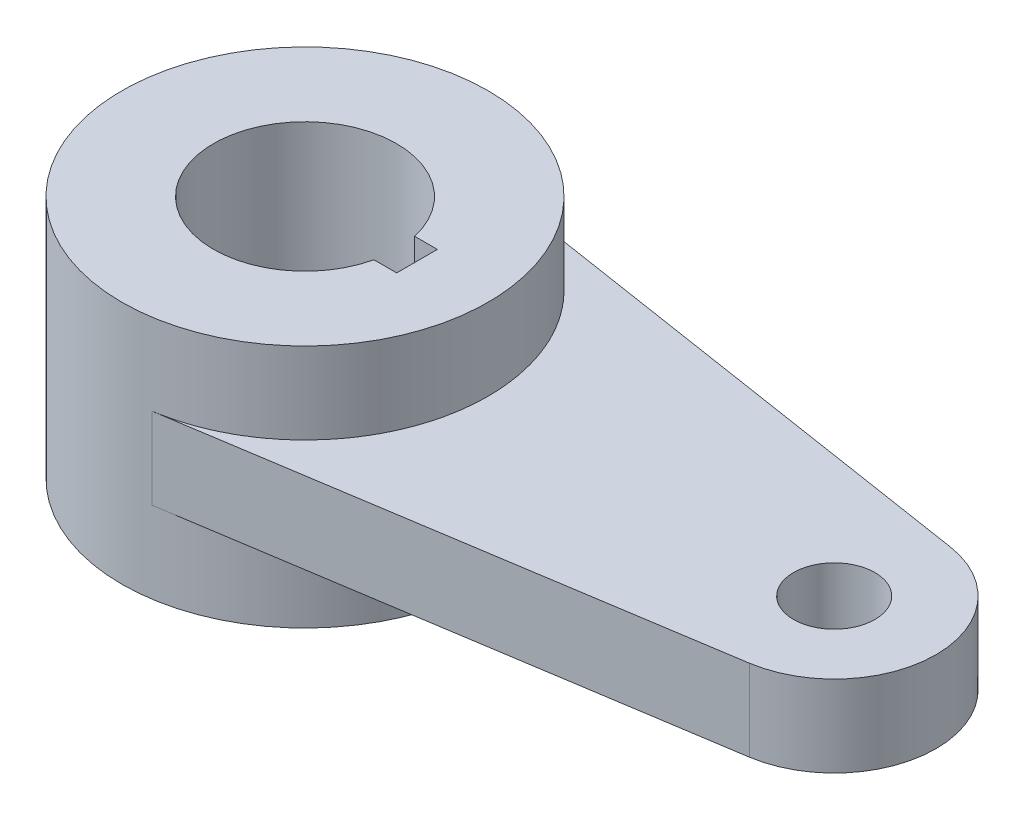
ISO-10303-21;
HEADER;
FILE_DESCRIPTION(('STEP AP214'),'2;1');
FILE_NAME('part.step','',(''),(''),'','','');
FILE_SCHEMA(('AUTOMOTIVE_DESIGN { 1 0 10303 214 1 1 1 1 }'));
ENDSEC;
DATA;
#1=APPLICATION_CONTEXT('core data for automotive mechanical design processes');
#2=APPLICATION_PROTOCOL_DEFINITION('international standard','automotive_design',2000,#1);
#3=PRODUCT_CONTEXT('',#1,'mechanical');
#4=PRODUCT('Part','Part','',(#3));
#5=PRODUCT_RELATED_PRODUCT_CATEGORY('part','',(#4));
#6=PRODUCT_DEFINITION_FORMATION('','',#4);
#7=PRODUCT_DEFINITION_CONTEXT('part definition',#1,'design');
#8=PRODUCT_DEFINITION('design','',#6,#7);
#9=PRODUCT_DEFINITION_SHAPE('','',#8);
#10=(LENGTH_UNIT() NAMED_UNIT(*) SI_UNIT(.MILLI.,.METRE.));
#11=(NAMED_UNIT(*) PLANE_ANGLE_UNIT() SI_UNIT($,.RADIAN.));
#12=(NAMED_UNIT(*) SI_UNIT($,.STERADIAN.) SOLID_ANGLE_UNIT());
#13=UNCERTAINTY_MEASURE_WITH_UNIT(LENGTH_MEASURE(1.E-05),#10,'distance_accuracy_value','');
#14=(GEOMETRIC_REPRESENTATION_CONTEXT(3) GLOBAL_UNCERTAINTY_ASSIGNED_CONTEXT((#13)) GLOBAL_UNIT_ASSIGNED_CONTEXT((#10,
#11,#12)) REPRESENTATION_CONTEXT('',''));
#15=CARTESIAN_POINT('',(0.,0.,0.));
#16=DIRECTION('',(0.,0.,1.));
#17=DIRECTION('',(1.,0.,0.));
#18=AXIS2_PLACEMENT_3D('',#15,#16,#17);
#19=CARTESIAN_POINT('',(0.,6.35,0.));
#20=DIRECTION('',(0.,1.,0.));
#21=DIRECTION('',(0.,0.,1.));
#22=AXIS2_PLACEMENT_3D('',#19,#20,#21);
#23=PLANE('',#22);
#24=CARTESIAN_POINT('',(0.,6.35,0.));
#25=DIRECTION('',(0.,-1.,0.));
#26=DIRECTION('',(0.,0.,1.));
#27=AXIS2_PLACEMENT_3D('',#24,#25,#26);
#28=CIRCLE('',#27,28.575);
#29=CARTESIAN_POINT('',(4.39615384615385,6.35,-28.2348093027197));
#30=VERTEX_POINT('',#29);
#31=CARTESIAN_POINT('',(4.39615384615385,6.35,28.2348093027197));
#32=VERTEX_POINT('',#31);
#33=EDGE_CURVE('E98',#30,#32,#28,.T.);
#34=ORIENTED_EDGE('',*,*,#33,.T.);
#35=DIRECTION('',(0.988094813743471,0.,-0.153846153846154));
#36=VECTOR('',#35,1.);
#37=CARTESIAN_POINT('',(4.39615384615385,6.35,28.2348093027197));
#38=LINE('',#37,#36);
#39=CARTESIAN_POINT('',(84.9923076923077,6.35,15.6860051681776));
#40=VERTEX_POINT('',#39);
#41=EDGE_CURVE('E93',#32,#40,#38,.T.);
#42=ORIENTED_EDGE('',*,*,#41,.T.);
#43=CARTESIAN_POINT('',(82.55,6.35,0.));
#44=DIRECTION('',(0.,1.,0.));
#45=DIRECTION('',(0.,0.,1.));
#46=AXIS2_PLACEMENT_3D('',#43,#44,#45);
#47=CIRCLE('',#46,15.875);
#48=CARTESIAN_POINT('',(84.9923076923077,6.35,-15.6860051681776));
#49=VERTEX_POINT('',#48);
#50=EDGE_CURVE('E96',#40,#49,#47,.T.);
#51=ORIENTED_EDGE('',*,*,#50,.T.);
#52=DIRECTION('',(-0.988094813743471,0.,-0.153846153846154));
#53=VECTOR('',#52,1.);
#54=CARTESIAN_POINT('',(4.39615384615385,6.35,-28.2348093027197));
#55=LINE('',#54,#53);
#56=EDGE_CURVE('E63',#49,#30,#55,.T.);
#57=ORIENTED_EDGE('',*,*,#56,.T.);
#58=EDGE_LOOP('',(#34,#42,#51,#57));
#59=FACE_BOUND('',#58,.T.);
#60=CARTESIAN_POINT('',(82.55,6.35,0.));
#61=DIRECTION('',(0.,1.,0.));
#62=DIRECTION('',(0.,0.,1.));
#63=AXIS2_PLACEMENT_3D('',#60,#61,#62);
#64=CIRCLE('',#63,6.35);
#65=CARTESIAN_POINT('',(82.55,6.35,6.35));
#66=VERTEX_POINT('',#65);
#67=EDGE_CURVE('E113',#66,#66,#64,.T.);
#68=ORIENTED_EDGE('',*,*,#67,.F.);
#69=EDGE_LOOP('',(#68));
#70=FACE_BOUND('',#69,.T.);
#71=ADVANCED_FACE('F46',(#59,#70),#23,.T.);
#72=CARTESIAN_POINT('',(0.,-6.35,0.));
#73=DIRECTION('',(0.,1.,0.));
#74=DIRECTION('',(0.,0.,1.));
#75=AXIS2_PLACEMENT_3D('',#72,#73,#74);
#76=PLANE('',#75);
#77=CARTESIAN_POINT('',(0.,-6.35,0.));
#78=DIRECTION('',(0.,-1.,0.));
#79=DIRECTION('',(0.,0.,1.));
#80=AXIS2_PLACEMENT_3D('',#77,#78,#79);
#81=CIRCLE('',#80,28.575);
#82=CARTESIAN_POINT('',(4.39615384615385,-6.35,-28.2348093027197));
#83=VERTEX_POINT('',#82);
#84=CARTESIAN_POINT('',(4.39615384615385,-6.35,28.2348093027197));
#85=VERTEX_POINT('',#84);
#86=EDGE_CURVE('E110',#83,#85,#81,.T.);
#87=ORIENTED_EDGE('',*,*,#86,.F.);
#88=DIRECTION('',(-0.988094813743471,0.,-0.153846153846154));
#89=VECTOR('',#88,1.);
#90=CARTESIAN_POINT('',(4.39615384615385,-6.35,-28.2348093027197));
#91=LINE('',#90,#89);
#92=CARTESIAN_POINT('',(84.9923076923077,-6.35,-15.6860051681776));
#93=VERTEX_POINT('',#92);
#94=EDGE_CURVE('E86',#93,#83,#91,.T.);
#95=ORIENTED_EDGE('',*,*,#94,.F.);
#96=CARTESIAN_POINT('',(82.55,-6.35,0.));
#97=DIRECTION('',(0.,1.,0.));
#98=DIRECTION('',(0.,0.,1.));
#99=AXIS2_PLACEMENT_3D('',#96,#97,#98);
#100=CIRCLE('',#99,15.875);
#101=CARTESIAN_POINT('',(84.9923076923077,-6.35,15.6860051681776));
#102=VERTEX_POINT('',#101);
#103=EDGE_CURVE('E80',#102,#93,#100,.T.);
#104=ORIENTED_EDGE('',*,*,#103,.F.);
#105=DIRECTION('',(0.988094813743471,0.,-0.153846153846154));
#106=VECTOR('',#105,1.);
#107=CARTESIAN_POINT('',(4.39615384615385,-6.35,28.2348093027197));
#108=LINE('',#107,#106);
#109=EDGE_CURVE('E102',#85,#102,#108,.T.);
#110=ORIENTED_EDGE('',*,*,#109,.F.);
#111=EDGE_LOOP('',(#87,#95,#104,#110));
#112=FACE_BOUND('',#111,.T.);
#113=CARTESIAN_POINT('',(82.55,-6.35,0.));
#114=DIRECTION('',(0.,1.,0.));
#115=DIRECTION('',(0.,0.,1.));
#116=AXIS2_PLACEMENT_3D('',#113,#114,#115);
#117=CIRCLE('',#116,6.35);
#118=CARTESIAN_POINT('',(82.55,-6.35,6.35));
#119=VERTEX_POINT('',#118);
#120=EDGE_CURVE('E125',#119,#119,#117,.T.);
#121=ORIENTED_EDGE('',*,*,#120,.T.);
#122=EDGE_LOOP('',(#121));
#123=FACE_BOUND('',#122,.T.);
#124=ADVANCED_FACE('F121',(#112,#123),#76,.F.);
#125=CARTESIAN_POINT('',(0.,6.35,0.));
#126=DIRECTION('',(0.,-1.,0.));
#127=DIRECTION('',(0.,0.,-1.));
#128=AXIS2_PLACEMENT_3D('',#125,#126,#127);
#129=CYLINDRICAL_SURFACE('',#128,28.575);
#130=ORIENTED_EDGE('',*,*,#86,.T.);
#131=DIRECTION('',(0.,-1.,0.));
#132=VECTOR('',#131,1.);
#133=CARTESIAN_POINT('',(4.39615384615385,6.35,28.2348093027197));
#134=LINE('',#133,#132);
#135=EDGE_CURVE('E12',#32,#85,#134,.T.);
#136=ORIENTED_EDGE('',*,*,#135,.F.);
#137=ORIENTED_EDGE('',*,*,#33,.F.);
#138=DIRECTION('',(0.,-1.,0.));
#139=VECTOR('',#138,1.);
#140=CARTESIAN_POINT('',(4.39615384615385,6.35,-28.2348093027197));
#141=LINE('',#140,#139);
#142=EDGE_CURVE('E106',#30,#83,#141,.T.);
#143=ORIENTED_EDGE('',*,*,#142,.T.);
#144=EDGE_LOOP('',(#130,#136,#137,#143));
#145=FACE_BOUND('',#144,.T.);
#146=ADVANCED_FACE('F48',(#145),#129,.F.);
#147=CARTESIAN_POINT('',(4.39615384615385,6.35,28.2348093027197));
#148=DIRECTION('',(-0.153846153846154,0.,-0.988094813743471));
#149=DIRECTION('',(-0.988094813743472,0.,0.153846153846154));
#150=AXIS2_PLACEMENT_3D('',#147,#148,#149);
#151=PLANE('',#150);
#152=ORIENTED_EDGE('',*,*,#109,.T.);
#153=DIRECTION('',(0.,-1.,0.));
#154=VECTOR('',#153,1.);
#155=CARTESIAN_POINT('',(84.9923076923077,6.35,15.6860051681776));
#156=LINE('',#155,#154);
#157=EDGE_CURVE('E55',#40,#102,#156,.T.);
#158=ORIENTED_EDGE('',*,*,#157,.F.);
#159=ORIENTED_EDGE('',*,*,#41,.F.);
#160=ORIENTED_EDGE('',*,*,#135,.T.);
#161=EDGE_LOOP('',(#152,#158,#159,#160));
#162=FACE_BOUND('',#161,.T.);
#163=ADVANCED_FACE('F101',(#162),#151,.F.);
#164=CARTESIAN_POINT('',(82.55,6.35,0.));
#165=DIRECTION('',(0.,-1.,0.));
#166=DIRECTION('',(0.,0.,-1.));
#167=AXIS2_PLACEMENT_3D('',#164,#165,#166);
#168=CYLINDRICAL_SURFACE('',#167,15.875);
#169=ORIENTED_EDGE('',*,*,#103,.T.);
#170=DIRECTION('',(0.,-1.,0.));
#171=VECTOR('',#170,1.);
#172=CARTESIAN_POINT('',(84.9923076923077,6.35,-15.6860051681776));
#173=LINE('',#172,#171);
#174=EDGE_CURVE('E103',#49,#93,#173,.T.);
#175=ORIENTED_EDGE('',*,*,#174,.F.);
#176=ORIENTED_EDGE('',*,*,#50,.F.);
#177=ORIENTED_EDGE('',*,*,#157,.T.);
#178=EDGE_LOOP('',(#169,#175,#176,#177));
#179=FACE_BOUND('',#178,.T.);
#180=ADVANCED_FACE('F104',(#179),#168,.T.);
#181=CARTESIAN_POINT('',(4.39615384615385,6.35,-28.2348093027197));
#182=DIRECTION('',(-0.153846153846154,0.,0.988094813743471));
#183=DIRECTION('',(0.988094813743472,0.,0.153846153846154));
#184=AXIS2_PLACEMENT_3D('',#181,#182,#183);
#185=PLANE('',#184);
#186=ORIENTED_EDGE('',*,*,#94,.T.);
#187=ORIENTED_EDGE('',*,*,#142,.F.);
#188=ORIENTED_EDGE('',*,*,#56,.F.);
#189=ORIENTED_EDGE('',*,*,#174,.T.);
#190=EDGE_LOOP('',(#186,#187,#188,#189));
#191=FACE_BOUND('',#190,.T.);
#192=ADVANCED_FACE('F118',(#191),#185,.F.);
#193=CARTESIAN_POINT('',(82.55,6.35,0.));
#194=DIRECTION('',(0.,-1.,0.));
#195=DIRECTION('',(0.,0.,-1.));
#196=AXIS2_PLACEMENT_3D('',#193,#194,#195);
#197=CYLINDRICAL_SURFACE('',#196,6.35);
#198=ORIENTED_EDGE('',*,*,#67,.T.);
#199=EDGE_LOOP('',(#198));
#200=FACE_BOUND('',#199,.T.);
#201=ORIENTED_EDGE('',*,*,#120,.F.);
#202=EDGE_LOOP('',(#201));
#203=FACE_BOUND('',#202,.T.);
#204=ADVANCED_FACE('F131',(#200,#203),#197,.F.);
#205=CLOSED_SHELL('',(#71,#124,#146,#163,#180,#192,#204));
#206=MANIFOLD_SOLID_BREP('B2',#205);
#207=CARTESIAN_POINT('',(0.,19.05,0.));
#208=DIRECTION('',(0.,1.,0.));
#209=DIRECTION('',(0.,0.,1.));
#210=AXIS2_PLACEMENT_3D('',#207,#208,#209);
#211=PLANE('',#210);
#212=CARTESIAN_POINT('',(0.,19.05,0.));
#213=DIRECTION('',(0.,1.,0.));
#214=DIRECTION('',(0.,0.,1.));
#215=AXIS2_PLACEMENT_3D('',#212,#213,#214);
#216=CIRCLE('',#215,28.575);
#217=CARTESIAN_POINT('',(0.,19.05,-28.575));
#218=VERTEX_POINT('',#217);
#219=EDGE_CURVE('E262',#218,#218,#216,.T.);
#220=ORIENTED_EDGE('',*,*,#219,.T.);
#221=EDGE_LOOP('',(#220));
#222=FACE_BOUND('',#221,.T.);
#223=CARTESIAN_POINT('',(0.,19.05,0.));
#224=DIRECTION('',(0.,1.,0.));
#225=DIRECTION('',(0.,0.,1.));
#226=AXIS2_PLACEMENT_3D('',#223,#224,#225);
#227=CIRCLE('',#226,14.2875);
#228=CARTESIAN_POINT('',(13.930255964985,19.05,-3.175));
#229=VERTEX_POINT('',#228);
#230=CARTESIAN_POINT('',(13.930255964985,19.05,3.175));
#231=VERTEX_POINT('',#230);
#232=EDGE_CURVE('E249',#229,#231,#227,.T.);
#233=ORIENTED_EDGE('',*,*,#232,.F.);
#234=DIRECTION('',(1.,0.,0.));
#235=VECTOR('',#234,1.);
#236=CARTESIAN_POINT('',(0.,19.05,-3.175));
#237=LINE('',#236,#235);
#238=CARTESIAN_POINT('',(17.4752,19.05,-3.175));
#239=VERTEX_POINT('',#238);
#240=EDGE_CURVE('E213',#229,#239,#237,.T.);
#241=ORIENTED_EDGE('',*,*,#240,.T.);
#242=DIRECTION('',(0.,0.,-1.));
#243=VECTOR('',#242,1.);
#244=CARTESIAN_POINT('',(17.4752,19.05,3.175));
#245=LINE('',#244,#243);
#246=CARTESIAN_POINT('',(17.4752,19.05,3.175));
#247=VERTEX_POINT('',#246);
#248=EDGE_CURVE('E241',#247,#239,#245,.T.);
#249=ORIENTED_EDGE('',*,*,#248,.F.);
#250=DIRECTION('',(1.,0.,0.));
#251=VECTOR('',#250,1.);
#252=CARTESIAN_POINT('',(0.,19.05,3.175));
#253=LINE('',#252,#251);
#254=EDGE_CURVE('E245',#231,#247,#253,.T.);
#255=ORIENTED_EDGE('',*,*,#254,.F.);
#256=EDGE_LOOP('',(#233,#241,#249,#255));
#257=FACE_BOUND('',#256,.T.);
#258=ADVANCED_FACE('F190',(#222,#257),#211,.T.);
#259=CARTESIAN_POINT('',(0.,-19.05,0.));
#260=DIRECTION('',(0.,1.,0.));
#261=DIRECTION('',(0.,0.,1.));
#262=AXIS2_PLACEMENT_3D('',#259,#260,#261);
#263=PLANE('',#262);
#264=CARTESIAN_POINT('',(0.,-19.05,0.));
#265=DIRECTION('',(0.,1.,0.));
#266=DIRECTION('',(0.,0.,1.));
#267=AXIS2_PLACEMENT_3D('',#264,#265,#266);
#268=CIRCLE('',#267,28.575);
#269=CARTESIAN_POINT('',(0.,-19.05,-28.575));
#270=VERTEX_POINT('',#269);
#271=EDGE_CURVE('E259',#270,#270,#268,.T.);
#272=ORIENTED_EDGE('',*,*,#271,.F.);
#273=EDGE_LOOP('',(#272));
#274=FACE_BOUND('',#273,.T.);
#275=DIRECTION('',(-1.,0.,0.));
#276=VECTOR('',#275,1.);
#277=CARTESIAN_POINT('',(0.,-19.05,-3.175));
#278=LINE('',#277,#276);
#279=CARTESIAN_POINT('',(17.4752,-19.05,-3.175));
#280=VERTEX_POINT('',#279);
#281=CARTESIAN_POINT('',(13.930255964985,-19.05,-3.175));
#282=VERTEX_POINT('',#281);
#283=EDGE_CURVE('E233',#280,#282,#278,.T.);
#284=ORIENTED_EDGE('',*,*,#283,.T.);
#285=CARTESIAN_POINT('',(0.,-19.05,0.));
#286=DIRECTION('',(0.,1.,0.));
#287=DIRECTION('',(0.,0.,1.));
#288=AXIS2_PLACEMENT_3D('',#285,#286,#287);
#289=CIRCLE('',#288,14.2875);
#290=CARTESIAN_POINT('',(13.930255964985,-19.05,3.175));
#291=VERTEX_POINT('',#290);
#292=EDGE_CURVE('E257',#282,#291,#289,.T.);
#293=ORIENTED_EDGE('',*,*,#292,.T.);
#294=DIRECTION('',(-1.,0.,0.));
#295=VECTOR('',#294,1.);
#296=CARTESIAN_POINT('',(0.,-19.05,3.175));
#297=LINE('',#296,#295);
#298=CARTESIAN_POINT('',(17.4752,-19.05,3.175));
#299=VERTEX_POINT('',#298);
#300=EDGE_CURVE('E205',#299,#291,#297,.T.);
#301=ORIENTED_EDGE('',*,*,#300,.F.);
#302=DIRECTION('',(0.,0.,1.));
#303=VECTOR('',#302,1.);
#304=CARTESIAN_POINT('',(17.4752,-19.05,3.175));
#305=LINE('',#304,#303);
#306=EDGE_CURVE('E236',#280,#299,#305,.T.);
#307=ORIENTED_EDGE('',*,*,#306,.F.);
#308=EDGE_LOOP('',(#284,#293,#301,#307));
#309=FACE_BOUND('',#308,.T.);
#310=ADVANCED_FACE('F271',(#274,#309),#263,.F.);
#311=CARTESIAN_POINT('',(0.,19.05,0.));
#312=DIRECTION('',(0.,-1.,0.));
#313=DIRECTION('',(0.,0.,-1.));
#314=AXIS2_PLACEMENT_3D('',#311,#312,#313);
#315=CYLINDRICAL_SURFACE('',#314,14.2875);
#316=ORIENTED_EDGE('',*,*,#292,.F.);
#317=DIRECTION('',(0.,-1.,0.));
#318=VECTOR('',#317,1.);
#319=CARTESIAN_POINT('',(13.930255964985,19.05,-3.175));
#320=LINE('',#319,#318);
#321=EDGE_CURVE('E44',#282,#229,#320,.F.);
#322=ORIENTED_EDGE('',*,*,#321,.T.);
#323=ORIENTED_EDGE('',*,*,#232,.T.);
#324=DIRECTION('',(0.,-1.,0.));
#325=VECTOR('',#324,1.);
#326=CARTESIAN_POINT('',(13.930255964985,19.05,3.175));
#327=LINE('',#326,#325);
#328=EDGE_CURVE('E198',#291,#231,#327,.F.);
#329=ORIENTED_EDGE('',*,*,#328,.F.);
#330=EDGE_LOOP('',(#316,#322,#323,#329));
#331=FACE_BOUND('',#330,.T.);
#332=ADVANCED_FACE('F269',(#331),#315,.F.);
#333=CARTESIAN_POINT('',(0.,19.05,0.));
#334=DIRECTION('',(0.,-1.,0.));
#335=DIRECTION('',(0.,0.,-1.));
#336=AXIS2_PLACEMENT_3D('',#333,#334,#335);
#337=CYLINDRICAL_SURFACE('',#336,28.575);
#338=CARTESIAN_POINT('',(0.,19.05,-28.575));
#339=CARTESIAN_POINT('',(0.,18.653125,-28.575));
#340=CARTESIAN_POINT('',(0.,18.25625,-28.575));
#341=CARTESIAN_POINT('',(0.,17.4625,-28.575));
#342=CARTESIAN_POINT('',(0.,17.065625,-28.575));
#343=CARTESIAN_POINT('',(0.,16.271875,-28.575));
#344=CARTESIAN_POINT('',(0.,15.875,-28.575));
#345=CARTESIAN_POINT('',(0.,15.08125,-28.575));
#346=CARTESIAN_POINT('',(0.,14.684375,-28.575));
#347=CARTESIAN_POINT('',(0.,13.890625,-28.575));
#348=CARTESIAN_POINT('',(0.,13.49375,-28.575));
#349=CARTESIAN_POINT('',(0.,12.7,-28.575));
#350=CARTESIAN_POINT('',(0.,12.303125,-28.575));
#351=CARTESIAN_POINT('',(0.,11.509375,-28.575));
#352=CARTESIAN_POINT('',(0.,11.1125,-28.575));
#353=CARTESIAN_POINT('',(0.,10.31875,-28.575));
#354=CARTESIAN_POINT('',(0.,9.921875,-28.575));
#355=CARTESIAN_POINT('',(0.,9.128125,-28.575));
#356=CARTESIAN_POINT('',(0.,8.73125,-28.575));
#357=CARTESIAN_POINT('',(0.,7.9375,-28.575));
#358=CARTESIAN_POINT('',(0.,7.540625,-28.575));
#359=CARTESIAN_POINT('',(0.,6.746875,-28.575));
#360=CARTESIAN_POINT('',(0.,6.35,-28.575));
#361=CARTESIAN_POINT('',(0.,5.55625,-28.575));
#362=CARTESIAN_POINT('',(0.,5.159375,-28.575));
#363=CARTESIAN_POINT('',(0.,4.365625,-28.575));
#364=CARTESIAN_POINT('',(0.,3.96875,-28.575));
#365=CARTESIAN_POINT('',(0.,3.175,-28.575));
#366=CARTESIAN_POINT('',(0.,2.778125,-28.575));
#367=CARTESIAN_POINT('',(0.,1.984375,-28.575));
#368=CARTESIAN_POINT('',(0.,1.5875,-28.575));
#369=CARTESIAN_POINT('',(0.,0.79375,-28.575));
#370=CARTESIAN_POINT('',(0.,0.396875,-28.575));
#371=CARTESIAN_POINT('',(0.,-0.396875,-28.575));
#372=CARTESIAN_POINT('',(0.,-0.79375,-28.575));
#373=CARTESIAN_POINT('',(0.,-1.5875,-28.575));
#374=CARTESIAN_POINT('',(0.,-1.984375,-28.575));
#375=CARTESIAN_POINT('',(0.,-2.778125,-28.575));
#376=CARTESIAN_POINT('',(0.,-3.175,-28.575));
#377=CARTESIAN_POINT('',(0.,-3.96875,-28.575));
#378=CARTESIAN_POINT('',(0.,-4.365625,-28.575));
#379=CARTESIAN_POINT('',(0.,-5.159375,-28.575));
#380=CARTESIAN_POINT('',(0.,-5.55625,-28.575));
#381=CARTESIAN_POINT('',(0.,-6.35,-28.575));
#382=CARTESIAN_POINT('',(0.,-6.746875,-28.575));
#383=CARTESIAN_POINT('',(0.,-7.540625,-28.575));
#384=CARTESIAN_POINT('',(0.,-7.9375,-28.575));
#385=CARTESIAN_POINT('',(0.,-8.73125,-28.575));
#386=CARTESIAN_POINT('',(0.,-9.128125,-28.575));
#387=CARTESIAN_POINT('',(0.,-9.921875,-28.575));
#388=CARTESIAN_POINT('',(0.,-10.31875,-28.575));
#389=CARTESIAN_POINT('',(0.,-11.1125,-28.575));
#390=CARTESIAN_POINT('',(0.,-11.509375,-28.575));
#391=CARTESIAN_POINT('',(0.,-12.303125,-28.575));
#392=CARTESIAN_POINT('',(0.,-12.7,-28.575));
#393=CARTESIAN_POINT('',(0.,-13.49375,-28.575));
#394=CARTESIAN_POINT('',(0.,-13.890625,-28.575));
#395=CARTESIAN_POINT('',(0.,-14.684375,-28.575));
#396=CARTESIAN_POINT('',(0.,-15.08125,-28.575));
#397=CARTESIAN_POINT('',(0.,-15.875,-28.575));
#398=CARTESIAN_POINT('',(0.,-16.271875,-28.575));
#399=CARTESIAN_POINT('',(0.,-17.065625,-28.575));
#400=CARTESIAN_POINT('',(0.,-17.4625,-28.575));
#401=CARTESIAN_POINT('',(0.,-18.25625,-28.575));
#402=CARTESIAN_POINT('',(0.,-18.653125,-28.575));
#403=CARTESIAN_POINT('',(0.,-19.05,-28.575));
#404=B_SPLINE_CURVE_WITH_KNOTS('',3,(#338,#339,#340,#341,#342,#343,#344,#345,#346,#347,#348,
#349,#350,#351,#352,#353,#354,#355,#356,#357,#358,#359,#360,#361,#362,#363,#364,#365,#366,#367,
#368,#369,#370,#371,#372,#373,#374,#375,#376,#377,#378,#379,#380,#381,#382,#383,#384,#385,#386,
#387,#388,#389,#390,#391,#392,#393,#394,#395,#396,#397,#398,#399,#400,#401,#402,#403),
.UNSPECIFIED.,.F.,.F.,(4,2,2,2,2,2,2,2,2,2,2,2,2,2,2,2,2,2,2,2,2,2,2,2,2,2,2,2,2,2,2,2,4),(0.,
1.190625,2.38125,3.571875,4.7625,5.953125,7.14375,8.334375,9.525,10.715625,11.90625,13.096875,
14.2875,15.478125,16.66875,17.859375,19.05,20.240625,21.43125,22.621875,23.8125,25.003125,
26.19375,27.384375,28.575,29.765625,30.95625,32.146875,33.3375,34.528125,35.71875,36.909375,
38.1),.UNSPECIFIED.);
#405=EDGE_CURVE('BSEAM192',#218,#270,#404,.T.);
#406=ORIENTED_EDGE('',*,*,#219,.F.);
#407=ORIENTED_EDGE('',*,*,#271,.T.);
#408=ORIENTED_EDGE('',*,*,#405,.T.);
#409=ORIENTED_EDGE('',*,*,#405,.F.);
#410=EDGE_LOOP('',(#406,#408,#407,#409));
#411=FACE_BOUND('',#410,.T.);
#412=ADVANCED_FACE('F192',(#411),#337,.T.);
#413=CARTESIAN_POINT('',(0.,-37.6431469912976,-3.175));
#414=DIRECTION('',(0.,0.,1.));
#415=DIRECTION('',(1.,0.,0.));
#416=AXIS2_PLACEMENT_3D('',#413,#414,#415);
#417=PLANE('',#416);
#418=ORIENTED_EDGE('',*,*,#283,.F.);
#419=DIRECTION('',(0.,1.,0.));
#420=VECTOR('',#419,1.);
#421=CARTESIAN_POINT('',(17.4752,-37.6431469912976,-3.175));
#422=LINE('',#421,#420);
#423=EDGE_CURVE('E229',#280,#239,#422,.T.);
#424=ORIENTED_EDGE('',*,*,#423,.T.);
#425=ORIENTED_EDGE('',*,*,#240,.F.);
#426=ORIENTED_EDGE('',*,*,#321,.F.);
#427=EDGE_LOOP('',(#418,#424,#425,#426));
#428=FACE_BOUND('',#427,.T.);
#429=ADVANCED_FACE('F231',(#428),#417,.T.);
#430=CARTESIAN_POINT('',(17.4752,-37.6431469912976,3.175));
#431=DIRECTION('',(1.,0.,0.));
#432=DIRECTION('',(0.,0.,-1.));
#433=AXIS2_PLACEMENT_3D('',#430,#431,#432);
#434=PLANE('',#433);
#435=ORIENTED_EDGE('',*,*,#306,.T.);
#436=DIRECTION('',(0.,1.,0.));
#437=VECTOR('',#436,1.);
#438=CARTESIAN_POINT('',(17.4752,-37.6431469912976,3.175));
#439=LINE('',#438,#437);
#440=EDGE_CURVE('E237',#299,#247,#439,.T.);
#441=ORIENTED_EDGE('',*,*,#440,.T.);
#442=ORIENTED_EDGE('',*,*,#248,.T.);
#443=ORIENTED_EDGE('',*,*,#423,.F.);
#444=EDGE_LOOP('',(#435,#441,#442,#443));
#445=FACE_BOUND('',#444,.T.);
#446=ADVANCED_FACE('F242',(#445),#434,.F.);
#447=CARTESIAN_POINT('',(0.,-37.6431469912976,3.175));
#448=DIRECTION('',(0.,0.,1.));
#449=DIRECTION('',(1.,0.,0.));
#450=AXIS2_PLACEMENT_3D('',#447,#448,#449);
#451=PLANE('',#450);
#452=ORIENTED_EDGE('',*,*,#328,.T.);
#453=ORIENTED_EDGE('',*,*,#254,.T.);
#454=ORIENTED_EDGE('',*,*,#440,.F.);
#455=ORIENTED_EDGE('',*,*,#300,.T.);
#456=EDGE_LOOP('',(#452,#453,#454,#455));
#457=FACE_BOUND('',#456,.T.);
#458=ADVANCED_FACE('F266',(#457),#451,.F.);
#459=CLOSED_SHELL('',(#258,#310,#332,#412,#429,#446,#458));
#460=MANIFOLD_SOLID_BREP('B6',#459);
#461=ADVANCED_BREP_SHAPE_REPRESENTATION('',(#18,#206,#460),#14);
#462=SHAPE_DEFINITION_REPRESENTATION(#9,#461);
ENDSEC;
END-ISO-10303-21;
